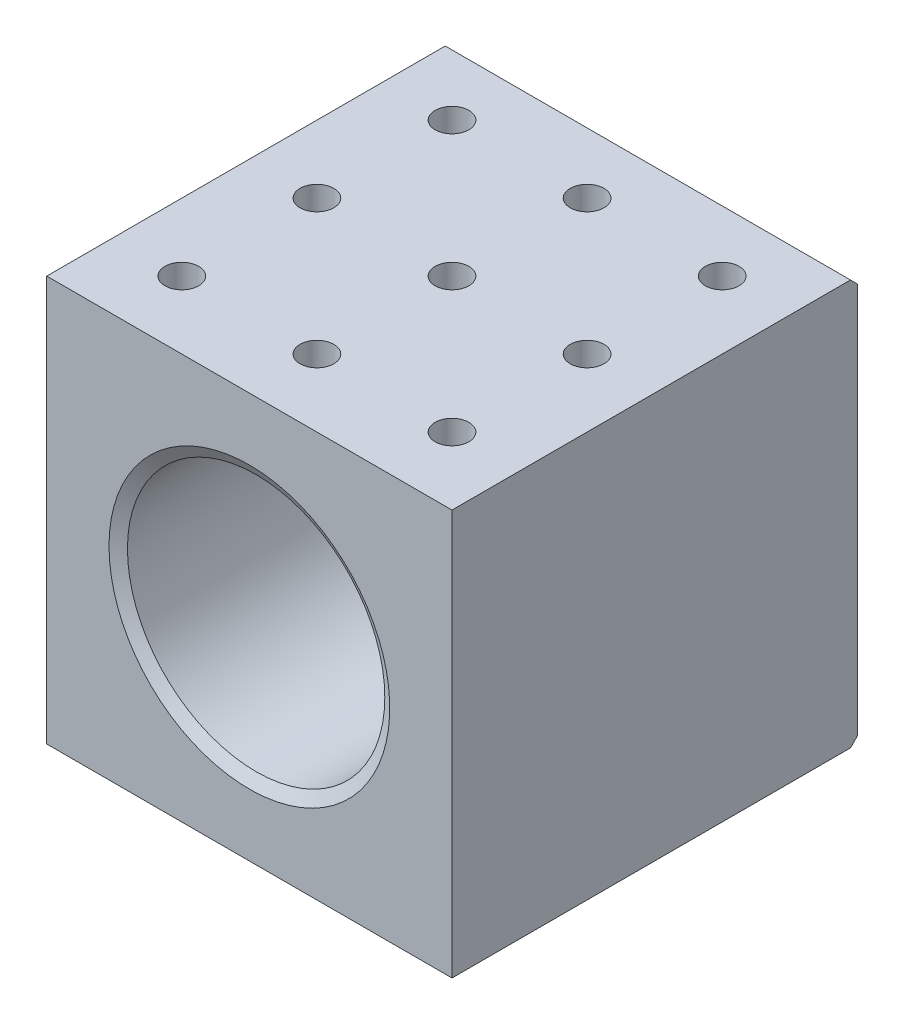
ISO-10303-21;
HEADER;
FILE_DESCRIPTION(('STEP AP214'),'2;1');
FILE_NAME('part.step','',(''),(''),'','','');
FILE_SCHEMA(('AUTOMOTIVE_DESIGN { 1 0 10303 214 1 1 1 1 }'));
ENDSEC;
DATA;
#1=APPLICATION_CONTEXT('core data for automotive mechanical design processes');
#2=APPLICATION_PROTOCOL_DEFINITION('international standard','automotive_design',2000,#1);
#3=PRODUCT_CONTEXT('',#1,'mechanical');
#4=PRODUCT('Part','Part','',(#3));
#5=PRODUCT_RELATED_PRODUCT_CATEGORY('part','',(#4));
#6=PRODUCT_DEFINITION_FORMATION('','',#4);
#7=PRODUCT_DEFINITION_CONTEXT('part definition',#1,'design');
#8=PRODUCT_DEFINITION('design','',#6,#7);
#9=PRODUCT_DEFINITION_SHAPE('','',#8);
#10=(LENGTH_UNIT() NAMED_UNIT(*) SI_UNIT(.MILLI.,.METRE.));
#11=(NAMED_UNIT(*) PLANE_ANGLE_UNIT() SI_UNIT($,.RADIAN.));
#12=(NAMED_UNIT(*) SI_UNIT($,.STERADIAN.) SOLID_ANGLE_UNIT());
#13=UNCERTAINTY_MEASURE_WITH_UNIT(LENGTH_MEASURE(1.E-05),#10,'distance_accuracy_value','');
#14=(GEOMETRIC_REPRESENTATION_CONTEXT(3) GLOBAL_UNCERTAINTY_ASSIGNED_CONTEXT((#13)) GLOBAL_UNIT_ASSIGNED_CONTEXT((#10,
#11,#12)) REPRESENTATION_CONTEXT('',''));
#15=CARTESIAN_POINT('',(0.,0.,0.));
#16=DIRECTION('',(0.,0.,1.));
#17=DIRECTION('',(1.,0.,0.));
#18=AXIS2_PLACEMENT_3D('',#15,#16,#17);
#19=CARTESIAN_POINT('',(0.,0.,15.));
#20=DIRECTION('',(0.,0.,-1.));
#21=DIRECTION('',(-1.,0.,0.));
#22=AXIS2_PLACEMENT_3D('',#19,#20,#21);
#23=PLANE('',#22);
#24=CARTESIAN_POINT('',(0.,0.,15.));
#25=DIRECTION('',(0.,0.,-1.));
#26=DIRECTION('',(-1.,0.,0.));
#27=AXIS2_PLACEMENT_3D('',#24,#25,#26);
#28=CIRCLE('',#27,10.3910254037845);
#29=CARTESIAN_POINT('',(-10.3910254037845,0.,15.));
#30=VERTEX_POINT('',#29);
#31=EDGE_CURVE('E254',#30,#30,#28,.T.);
#32=ORIENTED_EDGE('',*,*,#31,.T.);
#33=EDGE_LOOP('',(#32));
#34=FACE_BOUND('',#33,.T.);
#35=DIRECTION('',(0.,-1.,0.));
#36=VECTOR('',#35,1.);
#37=CARTESIAN_POINT('',(-15.,-15.,15.));
#38=LINE('',#37,#36);
#39=CARTESIAN_POINT('',(-15.,15.,15.));
#40=VERTEX_POINT('',#39);
#41=CARTESIAN_POINT('',(-15.,-15.,15.));
#42=VERTEX_POINT('',#41);
#43=EDGE_CURVE('E206',#40,#42,#38,.T.);
#44=ORIENTED_EDGE('',*,*,#43,.T.);
#45=DIRECTION('',(1.,0.,0.));
#46=VECTOR('',#45,1.);
#47=CARTESIAN_POINT('',(-15.,-15.,15.));
#48=LINE('',#47,#46);
#49=CARTESIAN_POINT('',(15.,-15.,15.));
#50=VERTEX_POINT('',#49);
#51=EDGE_CURVE('E210',#42,#50,#48,.T.);
#52=ORIENTED_EDGE('',*,*,#51,.T.);
#53=DIRECTION('',(0.,1.,0.));
#54=VECTOR('',#53,1.);
#55=CARTESIAN_POINT('',(15.,15.,15.));
#56=LINE('',#55,#54);
#57=CARTESIAN_POINT('',(15.,15.,15.));
#58=VERTEX_POINT('',#57);
#59=EDGE_CURVE('E214',#50,#58,#56,.T.);
#60=ORIENTED_EDGE('',*,*,#59,.T.);
#61=DIRECTION('',(-1.,0.,0.));
#62=VECTOR('',#61,1.);
#63=CARTESIAN_POINT('',(-15.,15.,15.));
#64=LINE('',#63,#62);
#65=EDGE_CURVE('E217',#58,#40,#64,.T.);
#66=ORIENTED_EDGE('',*,*,#65,.T.);
#67=EDGE_LOOP('',(#44,#52,#60,#66));
#68=FACE_BOUND('',#67,.T.);
#69=ADVANCED_FACE('F55',(#34,#68),#23,.F.);
#70=CARTESIAN_POINT('',(0.,0.,-15.));
#71=DIRECTION('',(0.,0.,-1.));
#72=DIRECTION('',(-1.,0.,0.));
#73=AXIS2_PLACEMENT_3D('',#70,#71,#72);
#74=PLANE('',#73);
#75=CARTESIAN_POINT('',(0.,0.,-15.));
#76=DIRECTION('',(0.,0.,-1.));
#77=DIRECTION('',(-1.,0.,0.));
#78=AXIS2_PLACEMENT_3D('',#75,#76,#77);
#79=CIRCLE('',#78,10.025);
#80=CARTESIAN_POINT('',(-10.025,0.,-15.));
#81=VERTEX_POINT('',#80);
#82=EDGE_CURVE('E242',#81,#81,#79,.F.);
#83=ORIENTED_EDGE('',*,*,#82,.T.);
#84=EDGE_LOOP('',(#83));
#85=FACE_BOUND('',#84,.T.);
#86=DIRECTION('',(0.,1.,0.));
#87=VECTOR('',#86,1.);
#88=CARTESIAN_POINT('',(15.,15.,-15.));
#89=LINE('',#88,#87);
#90=CARTESIAN_POINT('',(15.,-14.5,-15.));
#91=VERTEX_POINT('',#90);
#92=CARTESIAN_POINT('',(15.,14.5,-15.));
#93=VERTEX_POINT('',#92);
#94=EDGE_CURVE('E211',#91,#93,#89,.T.);
#95=ORIENTED_EDGE('',*,*,#94,.F.);
#96=DIRECTION('',(-1.,0.,0.));
#97=VECTOR('',#96,1.);
#98=CARTESIAN_POINT('',(-15.,-14.5,-15.));
#99=LINE('',#98,#97);
#100=CARTESIAN_POINT('',(-15.,-14.5,-15.));
#101=VERTEX_POINT('',#100);
#102=EDGE_CURVE('E86',#91,#101,#99,.T.);
#103=ORIENTED_EDGE('',*,*,#102,.T.);
#104=DIRECTION('',(0.,-1.,0.));
#105=VECTOR('',#104,1.);
#106=CARTESIAN_POINT('',(-15.,-15.,-15.));
#107=LINE('',#106,#105);
#108=CARTESIAN_POINT('',(-15.,14.5,-15.));
#109=VERTEX_POINT('',#108);
#110=EDGE_CURVE('E221',#109,#101,#107,.T.);
#111=ORIENTED_EDGE('',*,*,#110,.F.);
#112=DIRECTION('',(1.,0.,0.));
#113=VECTOR('',#112,1.);
#114=CARTESIAN_POINT('',(15.,14.5,-15.));
#115=LINE('',#114,#113);
#116=EDGE_CURVE('E268',#109,#93,#115,.T.);
#117=ORIENTED_EDGE('',*,*,#116,.T.);
#118=EDGE_LOOP('',(#95,#103,#111,#117));
#119=FACE_BOUND('',#118,.T.);
#120=ADVANCED_FACE('F347',(#85,#119),#74,.T.);
#121=CARTESIAN_POINT('',(-15.,-15.,15.));
#122=DIRECTION('',(1.,0.,0.));
#123=DIRECTION('',(0.,0.,-1.));
#124=AXIS2_PLACEMENT_3D('',#121,#122,#123);
#125=PLANE('',#124);
#126=ORIENTED_EDGE('',*,*,#110,.T.);
#127=DIRECTION('',(0.,-0.707106781186548,0.707106781186548));
#128=VECTOR('',#127,1.);
#129=CARTESIAN_POINT('',(-15.,-15.,-14.5));
#130=LINE('',#129,#128);
#131=CARTESIAN_POINT('',(-15.,-15.,-14.5));
#132=VERTEX_POINT('',#131);
#133=EDGE_CURVE('E71',#101,#132,#130,.T.);
#134=ORIENTED_EDGE('',*,*,#133,.T.);
#135=DIRECTION('',(0.,0.,-1.));
#136=VECTOR('',#135,1.);
#137=CARTESIAN_POINT('',(-15.,-15.,15.));
#138=LINE('',#137,#136);
#139=EDGE_CURVE('E238',#42,#132,#138,.T.);
#140=ORIENTED_EDGE('',*,*,#139,.F.);
#141=ORIENTED_EDGE('',*,*,#43,.F.);
#142=DIRECTION('',(0.,0.,-1.));
#143=VECTOR('',#142,1.);
#144=CARTESIAN_POINT('',(-15.,15.,15.));
#145=LINE('',#144,#143);
#146=CARTESIAN_POINT('',(-15.,15.,-14.5));
#147=VERTEX_POINT('',#146);
#148=EDGE_CURVE('E220',#40,#147,#145,.T.);
#149=ORIENTED_EDGE('',*,*,#148,.T.);
#150=DIRECTION('',(0.,-0.707106781186548,-0.707106781186548));
#151=VECTOR('',#150,1.);
#152=CARTESIAN_POINT('',(-15.,15.,-14.5));
#153=LINE('',#152,#151);
#154=EDGE_CURVE('E79',#147,#109,#153,.T.);
#155=ORIENTED_EDGE('',*,*,#154,.T.);
#156=EDGE_LOOP('',(#126,#134,#140,#141,#149,#155));
#157=FACE_BOUND('',#156,.T.);
#158=ADVANCED_FACE('F353',(#157),#125,.F.);
#159=CARTESIAN_POINT('',(-15.,-15.,15.));
#160=DIRECTION('',(0.,1.,0.));
#161=DIRECTION('',(-1.,0.,0.));
#162=AXIS2_PLACEMENT_3D('',#159,#160,#161);
#163=PLANE('',#162);
#164=ORIENTED_EDGE('',*,*,#139,.T.);
#165=DIRECTION('',(1.,0.,0.));
#166=VECTOR('',#165,1.);
#167=CARTESIAN_POINT('',(15.,-15.,-14.5));
#168=LINE('',#167,#166);
#169=CARTESIAN_POINT('',(15.,-15.,-14.5));
#170=VERTEX_POINT('',#169);
#171=EDGE_CURVE('E258',#132,#170,#168,.T.);
#172=ORIENTED_EDGE('',*,*,#171,.T.);
#173=DIRECTION('',(0.,0.,-1.));
#174=VECTOR('',#173,1.);
#175=CARTESIAN_POINT('',(15.,-15.,15.));
#176=LINE('',#175,#174);
#177=EDGE_CURVE('E234',#50,#170,#176,.T.);
#178=ORIENTED_EDGE('',*,*,#177,.F.);
#179=ORIENTED_EDGE('',*,*,#51,.F.);
#180=EDGE_LOOP('',(#164,#172,#178,#179));
#181=FACE_BOUND('',#180,.T.);
#182=ADVANCED_FACE('F365',(#181),#163,.F.);
#183=CARTESIAN_POINT('',(15.,15.,15.));
#184=DIRECTION('',(-1.,0.,0.));
#185=DIRECTION('',(0.,-1.,0.));
#186=AXIS2_PLACEMENT_3D('',#183,#184,#185);
#187=PLANE('',#186);
#188=ORIENTED_EDGE('',*,*,#177,.T.);
#189=DIRECTION('',(0.,0.707106781186548,-0.707106781186548));
#190=VECTOR('',#189,1.);
#191=CARTESIAN_POINT('',(15.,-15.,-14.5));
#192=LINE('',#191,#190);
#193=EDGE_CURVE('E265',#170,#91,#192,.T.);
#194=ORIENTED_EDGE('',*,*,#193,.T.);
#195=ORIENTED_EDGE('',*,*,#94,.T.);
#196=DIRECTION('',(0.,0.707106781186548,0.707106781186548));
#197=VECTOR('',#196,1.);
#198=CARTESIAN_POINT('',(15.,15.,-14.5));
#199=LINE('',#198,#197);
#200=CARTESIAN_POINT('',(15.,15.,-14.5));
#201=VERTEX_POINT('',#200);
#202=EDGE_CURVE('E262',#93,#201,#199,.T.);
#203=ORIENTED_EDGE('',*,*,#202,.T.);
#204=DIRECTION('',(0.,0.,-1.));
#205=VECTOR('',#204,1.);
#206=CARTESIAN_POINT('',(15.,15.,15.));
#207=LINE('',#206,#205);
#208=EDGE_CURVE('E230',#58,#201,#207,.T.);
#209=ORIENTED_EDGE('',*,*,#208,.F.);
#210=ORIENTED_EDGE('',*,*,#59,.F.);
#211=EDGE_LOOP('',(#188,#194,#195,#203,#209,#210));
#212=FACE_BOUND('',#211,.T.);
#213=ADVANCED_FACE('F361',(#212),#187,.F.);
#214=CARTESIAN_POINT('',(-15.,15.,15.));
#215=DIRECTION('',(0.,-1.,0.));
#216=DIRECTION('',(1.,0.,0.));
#217=AXIS2_PLACEMENT_3D('',#214,#215,#216);
#218=PLANE('',#217);
#219=CARTESIAN_POINT('',(-10.,15.,0.));
#220=DIRECTION('',(0.,1.,0.));
#221=DIRECTION('',(0.,0.,1.));
#222=AXIS2_PLACEMENT_3D('',#219,#220,#221);
#223=CIRCLE('',#222,1.25);
#224=CARTESIAN_POINT('',(-10.,15.,1.25));
#225=VERTEX_POINT('',#224);
#226=EDGE_CURVE('E147',#225,#225,#223,.T.);
#227=ORIENTED_EDGE('',*,*,#226,.F.);
#228=EDGE_LOOP('',(#227));
#229=FACE_BOUND('',#228,.T.);
#230=CARTESIAN_POINT('',(10.,15.,0.));
#231=DIRECTION('',(0.,1.,0.));
#232=DIRECTION('',(0.,0.,1.));
#233=AXIS2_PLACEMENT_3D('',#230,#231,#232);
#234=CIRCLE('',#233,1.25);
#235=CARTESIAN_POINT('',(10.,15.,1.25));
#236=VERTEX_POINT('',#235);
#237=EDGE_CURVE('E146',#236,#236,#234,.T.);
#238=ORIENTED_EDGE('',*,*,#237,.F.);
#239=EDGE_LOOP('',(#238));
#240=FACE_BOUND('',#239,.T.);
#241=CARTESIAN_POINT('',(0.,15.,0.));
#242=DIRECTION('',(0.,1.,0.));
#243=DIRECTION('',(0.,0.,1.));
#244=AXIS2_PLACEMENT_3D('',#241,#242,#243);
#245=CIRCLE('',#244,1.25);
#246=CARTESIAN_POINT('',(0.,15.,1.25));
#247=VERTEX_POINT('',#246);
#248=EDGE_CURVE('E160',#247,#247,#245,.T.);
#249=ORIENTED_EDGE('',*,*,#248,.F.);
#250=EDGE_LOOP('',(#249));
#251=FACE_BOUND('',#250,.T.);
#252=CARTESIAN_POINT('',(-10.,15.,-10.));
#253=DIRECTION('',(0.,1.,0.));
#254=DIRECTION('',(0.,0.,1.));
#255=AXIS2_PLACEMENT_3D('',#252,#253,#254);
#256=CIRCLE('',#255,1.25);
#257=CARTESIAN_POINT('',(-10.,15.,-8.75));
#258=VERTEX_POINT('',#257);
#259=EDGE_CURVE('E164',#258,#258,#256,.T.);
#260=ORIENTED_EDGE('',*,*,#259,.F.);
#261=EDGE_LOOP('',(#260));
#262=FACE_BOUND('',#261,.T.);
#263=CARTESIAN_POINT('',(-10.,15.,10.));
#264=DIRECTION('',(0.,1.,0.));
#265=DIRECTION('',(0.,0.,1.));
#266=AXIS2_PLACEMENT_3D('',#263,#264,#265);
#267=CIRCLE('',#266,1.25);
#268=CARTESIAN_POINT('',(-10.,15.,11.25));
#269=VERTEX_POINT('',#268);
#270=EDGE_CURVE('E172',#269,#269,#267,.T.);
#271=ORIENTED_EDGE('',*,*,#270,.F.);
#272=EDGE_LOOP('',(#271));
#273=FACE_BOUND('',#272,.T.);
#274=CARTESIAN_POINT('',(10.,15.,-10.));
#275=DIRECTION('',(0.,1.,0.));
#276=DIRECTION('',(0.,0.,1.));
#277=AXIS2_PLACEMENT_3D('',#274,#275,#276);
#278=CIRCLE('',#277,1.25);
#279=CARTESIAN_POINT('',(10.,15.,-8.75));
#280=VERTEX_POINT('',#279);
#281=EDGE_CURVE('E180',#280,#280,#278,.T.);
#282=ORIENTED_EDGE('',*,*,#281,.F.);
#283=EDGE_LOOP('',(#282));
#284=FACE_BOUND('',#283,.T.);
#285=CARTESIAN_POINT('',(10.,15.,10.));
#286=DIRECTION('',(0.,1.,0.));
#287=DIRECTION('',(0.,0.,1.));
#288=AXIS2_PLACEMENT_3D('',#285,#286,#287);
#289=CIRCLE('',#288,1.25);
#290=CARTESIAN_POINT('',(10.,15.,11.25));
#291=VERTEX_POINT('',#290);
#292=EDGE_CURVE('E188',#291,#291,#289,.T.);
#293=ORIENTED_EDGE('',*,*,#292,.F.);
#294=EDGE_LOOP('',(#293));
#295=FACE_BOUND('',#294,.T.);
#296=CARTESIAN_POINT('',(0.,15.,-10.));
#297=DIRECTION('',(0.,1.,0.));
#298=DIRECTION('',(0.,0.,1.));
#299=AXIS2_PLACEMENT_3D('',#296,#297,#298);
#300=CIRCLE('',#299,1.25);
#301=CARTESIAN_POINT('',(0.,15.,-8.75));
#302=VERTEX_POINT('',#301);
#303=EDGE_CURVE('E196',#302,#302,#300,.T.);
#304=ORIENTED_EDGE('',*,*,#303,.F.);
#305=EDGE_LOOP('',(#304));
#306=FACE_BOUND('',#305,.T.);
#307=CARTESIAN_POINT('',(0.,15.,10.));
#308=DIRECTION('',(0.,1.,0.));
#309=DIRECTION('',(0.,0.,1.));
#310=AXIS2_PLACEMENT_3D('',#307,#308,#309);
#311=CIRCLE('',#310,1.25);
#312=CARTESIAN_POINT('',(0.,15.,11.25));
#313=VERTEX_POINT('',#312);
#314=EDGE_CURVE('E201',#313,#313,#311,.T.);
#315=ORIENTED_EDGE('',*,*,#314,.F.);
#316=EDGE_LOOP('',(#315));
#317=FACE_BOUND('',#316,.T.);
#318=ORIENTED_EDGE('',*,*,#208,.T.);
#319=DIRECTION('',(-1.,0.,0.));
#320=VECTOR('',#319,1.);
#321=CARTESIAN_POINT('',(-15.,15.,-14.5));
#322=LINE('',#321,#320);
#323=EDGE_CURVE('E11',#201,#147,#322,.T.);
#324=ORIENTED_EDGE('',*,*,#323,.T.);
#325=ORIENTED_EDGE('',*,*,#148,.F.);
#326=ORIENTED_EDGE('',*,*,#65,.F.);
#327=EDGE_LOOP('',(#318,#324,#325,#326));
#328=FACE_BOUND('',#327,.T.);
#329=ADVANCED_FACE('F358',(#229,#240,#251,#262,#273,#284,#295,#306,#317,#328),#218,.F.);
#330=CARTESIAN_POINT('',(0.,0.,15.));
#331=DIRECTION('',(0.,0.,-1.));
#332=DIRECTION('',(-1.,0.,0.));
#333=AXIS2_PLACEMENT_3D('',#330,#331,#332);
#334=CYLINDRICAL_SURFACE('',#333,9.525);
#335=CARTESIAN_POINT('',(0.,9.525,1.25));
#336=CARTESIAN_POINT('',(-0.0698908445200793,9.52499898596995,1.24999704931891));
#337=CARTESIAN_POINT('',(-0.139824639435347,9.52422264141759,1.24411855386082));
#338=CARTESIAN_POINT('',(-0.27774417784955,9.52120033392475,1.22076203109199));
#339=CARTESIAN_POINT('',(-0.345727844176988,9.518952860567,1.20327208196499));
#340=CARTESIAN_POINT('',(-0.477730651991829,9.51324134046286,1.15721856824004));
#341=CARTESIAN_POINT('',(-0.541752503331227,9.50977813633241,1.12866267196508));
#342=CARTESIAN_POINT('',(-0.664083764775871,9.50201975058155,1.0613051118828));
#343=CARTESIAN_POINT('',(-0.722394108915497,9.49772470533989,1.02250512719611));
#344=CARTESIAN_POINT('',(-0.832011154094293,9.48875270412421,0.935510300963678));
#345=CARTESIAN_POINT('',(-0.88327835170039,9.48407381180408,0.887265878082161));
#346=CARTESIAN_POINT('',(-0.977013449949314,9.47487696132217,0.782858192981347));
#347=CARTESIAN_POINT('',(-1.01948088935163,9.47035901160649,0.726694515932433));
#348=CARTESIAN_POINT('',(-1.09455975785718,9.46197661297454,0.607783736867021));
#349=CARTESIAN_POINT('',(-1.1271338797346,9.45811466133028,0.545012888277368));
#350=CARTESIAN_POINT('',(-1.18126316646653,9.4515073095938,0.414832451938452));
#351=CARTESIAN_POINT('',(-1.20281879115845,9.44876186290721,0.347423057903886));
#352=CARTESIAN_POINT('',(-1.23417850198932,9.44471701662963,0.210290451341234));
#353=CARTESIAN_POINT('',(-1.24404953022223,9.44340938278071,0.140582794399568));
#354=CARTESIAN_POINT('',(-1.25196704389927,9.44236307356307,0.00048903747048921));
#355=CARTESIAN_POINT('',(-1.25001405189975,9.44262432885811,-0.069897032397562));
#356=CARTESIAN_POINT('',(-1.23439385672255,9.44467874410638,-0.208881614173356));
#357=CARTESIAN_POINT('',(-1.22080058152931,9.44646223602916,-0.277488597980302));
#358=CARTESIAN_POINT('',(-1.18240111749693,9.45134508655108,-0.411439260225632));
#359=CARTESIAN_POINT('',(-1.15759468032022,9.45444447429322,-0.476782866354489));
#360=CARTESIAN_POINT('',(-1.09739419640763,9.46162079166662,-0.602580469964923));
#361=CARTESIAN_POINT('',(-1.06196821343834,9.46570066246681,-0.663019009717517));
#362=CARTESIAN_POINT('',(-0.981557073163777,9.47437601124965,-0.777121401169548));
#363=CARTESIAN_POINT('',(-0.936571434214305,9.47897151520593,-0.830784911305392));
#364=CARTESIAN_POINT('',(-0.837909156230847,9.48820325299715,-0.930242888836987));
#365=CARTESIAN_POINT('',(-0.784168831856059,9.49283953009469,-0.975974200067348));
#366=CARTESIAN_POINT('',(-0.669741430350354,9.50159768061089,-1.05777724724657));
#367=CARTESIAN_POINT('',(-0.609054334284059,9.50571955262732,-1.09384895686457));
#368=CARTESIAN_POINT('',(-0.482405964475214,9.51298740691907,-1.15530964508296));
#369=CARTESIAN_POINT('',(-0.416442644916573,9.51613300832311,-1.18069445578975));
#370=CARTESIAN_POINT('',(-0.281139182959165,9.52109051808703,-1.22000952293789));
#371=CARTESIAN_POINT('',(-0.211799215115208,9.52290249531034,-1.23394037082397));
#372=CARTESIAN_POINT('',(-0.0722566079430353,9.52497960652179,-1.24986971757699));
#373=CARTESIAN_POINT('',(-0.00206405669281693,9.52525601315131,-1.25195517612765));
#374=CARTESIAN_POINT('',(0.137669580937589,9.52426133353775,-1.24436434304517));
#375=CARTESIAN_POINT('',(0.207210682605878,9.52299028370223,-1.2346883281285));
#376=CARTESIAN_POINT('',(0.343409227684851,9.51905051431592,-1.20392147587359));
#377=CARTESIAN_POINT('',(0.410076245382912,9.51638689862853,-1.18287231264927));
#378=CARTESIAN_POINT('',(0.538934293027684,9.50996007075211,-1.13000014341496));
#379=CARTESIAN_POINT('',(0.601125156889448,9.5061968177879,-1.09817673788296));
#380=CARTESIAN_POINT('',(0.719652508112473,9.49796184622471,-1.02445052920448));
#381=CARTESIAN_POINT('',(0.775953888679997,9.49348624043087,-0.982491727714507));
#382=CARTESIAN_POINT('',(0.880746395544479,9.4843388238667,-0.889764709925934));
#383=CARTESIAN_POINT('',(0.929237178632502,9.47966700448582,-0.838996106715436));
#384=CARTESIAN_POINT('',(1.01734239363289,9.47061869563237,-0.72970659232319));
#385=CARTESIAN_POINT('',(1.05689902678323,9.46624425041374,-0.67113889173217));
#386=CARTESIAN_POINT('',(1.1256132088323,9.45832021872484,-0.548139723434801));
#387=CARTESIAN_POINT('',(1.1547709839075,9.45477061431477,-0.483708383301613));
#388=CARTESIAN_POINT('',(1.20176711520171,9.44891231175766,-0.350994096146556));
#389=CARTESIAN_POINT('',(1.21963755146962,9.44660009967147,-0.282722670936582));
#390=CARTESIAN_POINT('',(1.24365477933522,9.44346847890593,-0.144115580695131));
#391=CARTESIAN_POINT('',(1.24980217684765,9.4426489930739,-0.0737800225408424));
#392=CARTESIAN_POINT('',(1.25018693846831,9.44259801167003,0.0663835217608374));
#393=CARTESIAN_POINT('',(1.24451511937354,9.44335440729078,0.136211271501082));
#394=CARTESIAN_POINT('',(1.22161530004844,9.44634386353605,0.273911581315713));
#395=CARTESIAN_POINT('',(1.20438730265681,9.44857692379783,0.341784141870376));
#396=CARTESIAN_POINT('',(1.15889345110378,9.45426424049389,0.473632364901488));
#397=CARTESIAN_POINT('',(1.13063243724488,9.45771796134846,0.537609722037205));
#398=CARTESIAN_POINT('',(1.06388370356963,9.465458276128,0.659928965320984));
#399=CARTESIAN_POINT('',(1.02539580408997,9.46974488468458,0.718270752440247));
#400=CARTESIAN_POINT('',(0.938950428583845,9.47870739781261,0.828126396433741));
#401=CARTESIAN_POINT('',(0.890925343968055,9.48338593530287,0.879586841652105));
#402=CARTESIAN_POINT('',(0.78691064363724,9.49258219272797,0.973752414580849));
#403=CARTESIAN_POINT('',(0.730919159830635,9.49709987463121,1.01645548296788));
#404=CARTESIAN_POINT('',(0.612290215843527,9.50548649173664,1.09204841139897));
#405=CARTESIAN_POINT('',(0.549625921092735,9.5093526326094,1.12489645228047));
#406=CARTESIAN_POINT('',(0.419653348440683,9.51597253507549,1.17955526443433));
#407=CARTESIAN_POINT('',(0.352350150978138,9.51872749164518,1.20137789893218));
#408=CARTESIAN_POINT('',(0.237257518542989,9.52215863687289,1.22820574416349));
#409=CARTESIAN_POINT('',(0.190190562607772,9.52321889240151,1.23636667394512));
#410=CARTESIAN_POINT('',(0.0954224088599646,9.52463991720257,1.24726478634247));
#411=CARTESIAN_POINT('',(0.0477212164014278,9.52500069237606,1.25000201471439));
#412=CARTESIAN_POINT('',(0.,9.525,1.25));
#413=B_SPLINE_CURVE_WITH_KNOTS('',3,(#335,#336,#337,#338,#339,#340,#341,#342,#343,#344,#345,
#346,#347,#348,#349,#350,#351,#352,#353,#354,#355,#356,#357,#358,#359,#360,#361,#362,#363,#364,
#365,#366,#367,#368,#369,#370,#371,#372,#373,#374,#375,#376,#377,#378,#379,#380,#381,#382,#383,
#384,#385,#386,#387,#388,#389,#390,#391,#392,#393,#394,#395,#396,#397,#398,#399,#400,#401,#402,
#403,#404,#405,#406,#407,#408,#409,#410,#411,#412),.UNSPECIFIED.,.T.,.F.,(4,2,2,2,2,2,2,2,2,2,2,
2,2,2,2,2,2,2,2,2,2,2,2,2,2,2,2,2,2,2,2,2,2,2,2,2,2,2,4),(0.,0.209498207675428,
0.419211846581093,0.628780420230178,0.838314664549649,1.04897993895877,1.25965625262502,
1.47111742513662,1.68256977197093,1.89280473423349,2.10303040534015,2.31193074246016,
2.52083570631669,2.73037532395759,2.9399255013381,3.15107433542933,3.36222374507978,
3.57345542694482,3.78467620081991,3.99434433094807,4.20400752823324,4.41290762528587,
4.6218154694571,4.83190505355924,5.04200386678423,5.25342526501399,5.46484206452131,
5.67565525439724,5.88645754792762,6.0956460478033,6.30483449629311,6.51393127451434,
6.72303172633691,6.93367109595178,7.1443599413903,7.35593058126479,7.56727308584749,
7.71031891275546,7.85336353287475),.UNSPECIFIED.);
#414=CARTESIAN_POINT('',(0.,9.525,1.25));
#415=VERTEX_POINT('',#414);
#416=EDGE_CURVE('E60',#415,#415,#413,.T.);
#417=ORIENTED_EDGE('',*,*,#416,.F.);
#418=EDGE_LOOP('',(#417));
#419=FACE_BOUND('',#418,.T.);
#420=CARTESIAN_POINT('',(0.,9.525,-8.75));
#421=CARTESIAN_POINT('',(-0.0698908445200794,9.52499898596995,-8.75000295068109));
#422=CARTESIAN_POINT('',(-0.139824639435347,9.52422264141759,-8.75588144613918));
#423=CARTESIAN_POINT('',(-0.277744177849551,9.52120033392475,-8.779237968908));
#424=CARTESIAN_POINT('',(-0.345727844176988,9.518952860567,-8.79672791803501));
#425=CARTESIAN_POINT('',(-0.477730651991829,9.51324134046286,-8.84278143175996));
#426=CARTESIAN_POINT('',(-0.541752503331227,9.50977813633241,-8.87133732803492));
#427=CARTESIAN_POINT('',(-0.664083764775871,9.50201975058155,-8.9386948881172));
#428=CARTESIAN_POINT('',(-0.722394108915497,9.49772470533989,-8.97749487280388));
#429=CARTESIAN_POINT('',(-0.832011154094292,9.48875270412421,-9.06448969903632));
#430=CARTESIAN_POINT('',(-0.88327835170039,9.48407381180408,-9.11273412191784));
#431=CARTESIAN_POINT('',(-0.977013449949313,9.47487696132217,-9.21714180701865));
#432=CARTESIAN_POINT('',(-1.01948088935163,9.47035901160649,-9.27330548406757));
#433=CARTESIAN_POINT('',(-1.09455975785718,9.46197661297454,-9.39221626313298));
#434=CARTESIAN_POINT('',(-1.1271338797346,9.45811466133028,-9.45498711172263));
#435=CARTESIAN_POINT('',(-1.18126316646653,9.45150730959381,-9.58516754806154));
#436=CARTESIAN_POINT('',(-1.20281879115845,9.44876186290721,-9.65257694209611));
#437=CARTESIAN_POINT('',(-1.23417850198932,9.44471701662963,-9.78970954865876));
#438=CARTESIAN_POINT('',(-1.24404953022223,9.44340938278071,-9.85941720560043));
#439=CARTESIAN_POINT('',(-1.25196704389927,9.44236307356307,-9.99951096252951));
#440=CARTESIAN_POINT('',(-1.25001405189975,9.44262432885811,-10.0698970323976));
#441=CARTESIAN_POINT('',(-1.23439385672255,9.44467874410638,-10.2088816141734));
#442=CARTESIAN_POINT('',(-1.22080058152931,9.44646223602916,-10.2774885979803));
#443=CARTESIAN_POINT('',(-1.18240111749693,9.45134508655108,-10.4114392602256));
#444=CARTESIAN_POINT('',(-1.15759468032022,9.45444447429322,-10.4767828663545));
#445=CARTESIAN_POINT('',(-1.09739419640763,9.46162079166662,-10.6025804699649));
#446=CARTESIAN_POINT('',(-1.06196821343834,9.46570066246681,-10.6630190097175));
#447=CARTESIAN_POINT('',(-0.981557073163777,9.47437601124965,-10.7771214011695));
#448=CARTESIAN_POINT('',(-0.936571434214305,9.47897151520593,-10.8307849113054));
#449=CARTESIAN_POINT('',(-0.837909156230847,9.48820325299715,-10.930242888837));
#450=CARTESIAN_POINT('',(-0.784168831856057,9.49283953009469,-10.9759742000673));
#451=CARTESIAN_POINT('',(-0.669741430350353,9.50159768061089,-11.0577772472466));
#452=CARTESIAN_POINT('',(-0.609054334284059,9.50571955262732,-11.0938489568646));
#453=CARTESIAN_POINT('',(-0.482405964475215,9.51298740691907,-11.155309645083));
#454=CARTESIAN_POINT('',(-0.416442644916573,9.51613300832311,-11.1806944557897));
#455=CARTESIAN_POINT('',(-0.281139182959165,9.52109051808703,-11.2200095229379));
#456=CARTESIAN_POINT('',(-0.211799215115207,9.52290249531034,-11.233940370824));
#457=CARTESIAN_POINT('',(-0.0722566079430346,9.52497960652179,-11.249869717577));
#458=CARTESIAN_POINT('',(-0.00206405669281604,9.52525601315131,-11.2519551761277));
#459=CARTESIAN_POINT('',(0.13766958093759,9.52426133353775,-11.2443643430452));
#460=CARTESIAN_POINT('',(0.207210682605879,9.52299028370223,-11.2346883281285));
#461=CARTESIAN_POINT('',(0.343409227684851,9.51905051431592,-11.2039214758736));
#462=CARTESIAN_POINT('',(0.410076245382912,9.51638689862853,-11.1828723126493));
#463=CARTESIAN_POINT('',(0.538934293027685,9.50996007075211,-11.130000143415));
#464=CARTESIAN_POINT('',(0.601125156889449,9.5061968177879,-11.098176737883));
#465=CARTESIAN_POINT('',(0.719652508112474,9.49796184622471,-11.0244505292045));
#466=CARTESIAN_POINT('',(0.775953888679998,9.49348624043087,-10.9824917277145));
#467=CARTESIAN_POINT('',(0.88074639554448,9.4843388238667,-10.8897647099259));
#468=CARTESIAN_POINT('',(0.929237178632503,9.47966700448582,-10.8389961067154));
#469=CARTESIAN_POINT('',(1.01734239363289,9.47061869563237,-10.7297065923232));
#470=CARTESIAN_POINT('',(1.05689902678323,9.46624425041374,-10.6711388917322));
#471=CARTESIAN_POINT('',(1.1256132088323,9.45832021872484,-10.5481397234348));
#472=CARTESIAN_POINT('',(1.1547709839075,9.45477061431477,-10.4837083833016));
#473=CARTESIAN_POINT('',(1.20176711520171,9.44891231175766,-10.3509940961466));
#474=CARTESIAN_POINT('',(1.21963755146962,9.44660009967147,-10.2827226709366));
#475=CARTESIAN_POINT('',(1.24365477933522,9.44346847890593,-10.1441155806951));
#476=CARTESIAN_POINT('',(1.24980217684765,9.4426489930739,-10.0737800225408));
#477=CARTESIAN_POINT('',(1.25018693846831,9.44259801167003,-9.93361647823916));
#478=CARTESIAN_POINT('',(1.24451511937354,9.44335440729078,-9.86378872849892));
#479=CARTESIAN_POINT('',(1.22161530004844,9.44634386353605,-9.72608841868428));
#480=CARTESIAN_POINT('',(1.20438730265681,9.44857692379783,-9.65821585812962));
#481=CARTESIAN_POINT('',(1.15889345110378,9.45426424049389,-9.52636763509851));
#482=CARTESIAN_POINT('',(1.13063243724488,9.45771796134846,-9.46239027796279));
#483=CARTESIAN_POINT('',(1.06388370356962,9.465458276128,-9.34007103467901));
#484=CARTESIAN_POINT('',(1.02539580408997,9.46974488468458,-9.28172924755975));
#485=CARTESIAN_POINT('',(0.938950428583844,9.47870739781261,-9.17187360356626));
#486=CARTESIAN_POINT('',(0.890925343968054,9.48338593530287,-9.12041315834789));
#487=CARTESIAN_POINT('',(0.786910643637239,9.49258219272797,-9.02624758541915));
#488=CARTESIAN_POINT('',(0.730919159830634,9.49709987463121,-8.98354451703211));
#489=CARTESIAN_POINT('',(0.612290215843526,9.50548649173664,-8.90795158860102));
#490=CARTESIAN_POINT('',(0.549625921092735,9.5093526326094,-8.87510354771953));
#491=CARTESIAN_POINT('',(0.419653348440683,9.51597253507549,-8.82044473556567));
#492=CARTESIAN_POINT('',(0.352350150978138,9.51872749164518,-8.79862210106782));
#493=CARTESIAN_POINT('',(0.237257518542989,9.52215863687289,-8.77179425583651));
#494=CARTESIAN_POINT('',(0.190190562607772,9.52321889240151,-8.76363332605488));
#495=CARTESIAN_POINT('',(0.0954224088599644,9.52463991720257,-8.75273521365753));
#496=CARTESIAN_POINT('',(0.0477212164014277,9.52500069237606,-8.7499979852856));
#497=CARTESIAN_POINT('',(0.,9.525,-8.75));
#498=B_SPLINE_CURVE_WITH_KNOTS('',3,(#420,#421,#422,#423,#424,#425,#426,#427,#428,#429,#430,
#431,#432,#433,#434,#435,#436,#437,#438,#439,#440,#441,#442,#443,#444,#445,#446,#447,#448,#449,
#450,#451,#452,#453,#454,#455,#456,#457,#458,#459,#460,#461,#462,#463,#464,#465,#466,#467,#468,
#469,#470,#471,#472,#473,#474,#475,#476,#477,#478,#479,#480,#481,#482,#483,#484,#485,#486,#487,
#488,#489,#490,#491,#492,#493,#494,#495,#496,#497),.UNSPECIFIED.,.T.,.F.,(4,2,2,2,2,2,2,2,2,2,2,
2,2,2,2,2,2,2,2,2,2,2,2,2,2,2,2,2,2,2,2,2,2,2,2,2,2,2,4),(0.,0.209498207675428,
0.419211846581093,0.628780420230178,0.838314664549649,1.04897993895877,1.25965625262502,
1.47111742513662,1.68256977197093,1.89280473423349,2.10303040534015,2.31193074246016,
2.52083570631669,2.73037532395759,2.93992550133811,3.15107433542933,3.36222374507978,
3.57345542694482,3.78467620081991,3.99434433094807,4.20400752823324,4.41290762528587,
4.6218154694571,4.83190505355925,5.04200386678424,5.25342526501399,5.46484206452132,
5.67565525439725,5.88645754792762,6.0956460478033,6.30483449629311,6.51393127451434,
6.72303172633691,6.93367109595178,7.14435994139031,7.35593058126479,7.5672730858475,
7.71031891275547,7.85336353287476),.UNSPECIFIED.);
#499=CARTESIAN_POINT('',(0.,9.525,-8.75));
#500=VERTEX_POINT('',#499);
#501=EDGE_CURVE('E200',#500,#500,#498,.T.);
#502=ORIENTED_EDGE('',*,*,#501,.F.);
#503=EDGE_LOOP('',(#502));
#504=FACE_BOUND('',#503,.T.);
#505=CARTESIAN_POINT('',(0.,9.525,11.25));
#506=CARTESIAN_POINT('',(-0.0698908445200793,9.52499898596995,11.2499970493189));
#507=CARTESIAN_POINT('',(-0.139824639435347,9.52422264141759,11.2441185538608));
#508=CARTESIAN_POINT('',(-0.27774417784955,9.52120033392475,11.220762031092));
#509=CARTESIAN_POINT('',(-0.345727844176988,9.518952860567,11.203272081965));
#510=CARTESIAN_POINT('',(-0.477730651991829,9.51324134046286,11.15721856824));
#511=CARTESIAN_POINT('',(-0.541752503331227,9.50977813633241,11.1286626719651));
#512=CARTESIAN_POINT('',(-0.664083764775871,9.50201975058155,11.0613051118828));
#513=CARTESIAN_POINT('',(-0.722394108915497,9.49772470533989,11.0225051271961));
#514=CARTESIAN_POINT('',(-0.832011154094292,9.48875270412421,10.9355103009637));
#515=CARTESIAN_POINT('',(-0.88327835170039,9.48407381180408,10.8872658780822));
#516=CARTESIAN_POINT('',(-0.977013449949314,9.47487696132217,10.7828581929814));
#517=CARTESIAN_POINT('',(-1.01948088935163,9.47035901160649,10.7266945159324));
#518=CARTESIAN_POINT('',(-1.09455975785718,9.46197661297454,10.607783736867));
#519=CARTESIAN_POINT('',(-1.1271338797346,9.45811466133028,10.5450128882774));
#520=CARTESIAN_POINT('',(-1.18126316646653,9.45150730959381,10.4148324519385));
#521=CARTESIAN_POINT('',(-1.20281879115845,9.44876186290721,10.3474230579039));
#522=CARTESIAN_POINT('',(-1.23417850198932,9.44471701662963,10.2102904513412));
#523=CARTESIAN_POINT('',(-1.24404953022223,9.44340938278071,10.1405827943996));
#524=CARTESIAN_POINT('',(-1.25196704389927,9.44236307356307,10.0004890374705));
#525=CARTESIAN_POINT('',(-1.25001405189975,9.44262432885811,9.93010296760244));
#526=CARTESIAN_POINT('',(-1.23439385672255,9.44467874410638,9.79111838582665));
#527=CARTESIAN_POINT('',(-1.22080058152931,9.44646223602916,9.7225114020197));
#528=CARTESIAN_POINT('',(-1.18240111749693,9.45134508655108,9.58856073977437));
#529=CARTESIAN_POINT('',(-1.15759468032022,9.45444447429322,9.52321713364551));
#530=CARTESIAN_POINT('',(-1.09739419640763,9.46162079166662,9.39741953003508));
#531=CARTESIAN_POINT('',(-1.06196821343834,9.46570066246681,9.33698099028248));
#532=CARTESIAN_POINT('',(-0.981557073163777,9.47437601124965,9.22287859883045));
#533=CARTESIAN_POINT('',(-0.936571434214305,9.47897151520593,9.16921508869461));
#534=CARTESIAN_POINT('',(-0.837909156230847,9.48820325299715,9.06975711116301));
#535=CARTESIAN_POINT('',(-0.784168831856058,9.49283953009469,9.02402579993265));
#536=CARTESIAN_POINT('',(-0.669741430350354,9.50159768061089,8.94222275275343));
#537=CARTESIAN_POINT('',(-0.609054334284059,9.50571955262732,8.90615104313543));
#538=CARTESIAN_POINT('',(-0.482405964475214,9.51298740691907,8.84469035491704));
#539=CARTESIAN_POINT('',(-0.416442644916573,9.51613300832311,8.81930554421025));
#540=CARTESIAN_POINT('',(-0.281139182959165,9.52109051808703,8.77999047706211));
#541=CARTESIAN_POINT('',(-0.211799215115207,9.52290249531034,8.76605962917603));
#542=CARTESIAN_POINT('',(-0.0722566079430346,9.52497960652179,8.75013028242301));
#543=CARTESIAN_POINT('',(-0.00206405669281604,9.52525601315131,8.74804482387235));
#544=CARTESIAN_POINT('',(0.13766958093759,9.52426133353775,8.75563565695483));
#545=CARTESIAN_POINT('',(0.207210682605879,9.52299028370223,8.7653116718715));
#546=CARTESIAN_POINT('',(0.343409227684851,9.51905051431592,8.79607852412641));
#547=CARTESIAN_POINT('',(0.410076245382912,9.51638689862853,8.81712768735074));
#548=CARTESIAN_POINT('',(0.538934293027685,9.50996007075211,8.86999985658504));
#549=CARTESIAN_POINT('',(0.601125156889449,9.5061968177879,8.90182326211704));
#550=CARTESIAN_POINT('',(0.719652508112474,9.49796184622471,8.97554947079552));
#551=CARTESIAN_POINT('',(0.775953888679998,9.49348624043087,9.01750827228549));
#552=CARTESIAN_POINT('',(0.88074639554448,9.4843388238667,9.11023529007407));
#553=CARTESIAN_POINT('',(0.929237178632503,9.47966700448582,9.16100389328457));
#554=CARTESIAN_POINT('',(1.01734239363289,9.47061869563237,9.27029340767681));
#555=CARTESIAN_POINT('',(1.05689902678323,9.46624425041374,9.32886110826783));
#556=CARTESIAN_POINT('',(1.1256132088323,9.45832021872484,9.4518602765652));
#557=CARTESIAN_POINT('',(1.15477098390751,9.45477061431477,9.51629161669839));
#558=CARTESIAN_POINT('',(1.20176711520171,9.44891231175766,9.64900590385345));
#559=CARTESIAN_POINT('',(1.21963755146962,9.44660009967147,9.71727732906342));
#560=CARTESIAN_POINT('',(1.24365477933522,9.44346847890593,9.85588441930487));
#561=CARTESIAN_POINT('',(1.24980217684765,9.4426489930739,9.92621997745916));
#562=CARTESIAN_POINT('',(1.25018693846831,9.44259801167003,10.0663835217608));
#563=CARTESIAN_POINT('',(1.24451511937354,9.44335440729078,10.1362112715011));
#564=CARTESIAN_POINT('',(1.22161530004844,9.44634386353605,10.2739115813157));
#565=CARTESIAN_POINT('',(1.20438730265681,9.44857692379783,10.3417841418704));
#566=CARTESIAN_POINT('',(1.15889345110378,9.45426424049389,10.4736323649015));
#567=CARTESIAN_POINT('',(1.13063243724488,9.45771796134846,10.5376097220372));
#568=CARTESIAN_POINT('',(1.06388370356962,9.465458276128,10.659928965321));
#569=CARTESIAN_POINT('',(1.02539580408997,9.46974488468458,10.7182707524402));
#570=CARTESIAN_POINT('',(0.938950428583845,9.47870739781261,10.8281263964337));
#571=CARTESIAN_POINT('',(0.890925343968055,9.48338593530287,10.8795868416521));
#572=CARTESIAN_POINT('',(0.78691064363724,9.49258219272797,10.9737524145809));
#573=CARTESIAN_POINT('',(0.730919159830635,9.49709987463121,11.0164554829679));
#574=CARTESIAN_POINT('',(0.612290215843526,9.50548649173664,11.092048411399));
#575=CARTESIAN_POINT('',(0.549625921092735,9.5093526326094,11.1248964522805));
#576=CARTESIAN_POINT('',(0.419653348440683,9.51597253507549,11.1795552644343));
#577=CARTESIAN_POINT('',(0.352350150978138,9.51872749164518,11.2013778989322));
#578=CARTESIAN_POINT('',(0.237257518542989,9.52215863687289,11.2282057441635));
#579=CARTESIAN_POINT('',(0.190190562607772,9.52321889240151,11.2363666739451));
#580=CARTESIAN_POINT('',(0.0954224088599644,9.52463991720257,11.2472647863425));
#581=CARTESIAN_POINT('',(0.0477212164014277,9.52500069237606,11.2500020147144));
#582=CARTESIAN_POINT('',(0.,9.525,11.25));
#583=B_SPLINE_CURVE_WITH_KNOTS('',3,(#505,#506,#507,#508,#509,#510,#511,#512,#513,#514,#515,
#516,#517,#518,#519,#520,#521,#522,#523,#524,#525,#526,#527,#528,#529,#530,#531,#532,#533,#534,
#535,#536,#537,#538,#539,#540,#541,#542,#543,#544,#545,#546,#547,#548,#549,#550,#551,#552,#553,
#554,#555,#556,#557,#558,#559,#560,#561,#562,#563,#564,#565,#566,#567,#568,#569,#570,#571,#572,
#573,#574,#575,#576,#577,#578,#579,#580,#581,#582),.UNSPECIFIED.,.T.,.F.,(4,2,2,2,2,2,2,2,2,2,2,
2,2,2,2,2,2,2,2,2,2,2,2,2,2,2,2,2,2,2,2,2,2,2,2,2,2,2,4),(0.,0.209498207675428,
0.419211846581093,0.628780420230178,0.838314664549649,1.04897993895877,1.25965625262502,
1.47111742513662,1.68256977197093,1.89280473423349,2.10303040534016,2.31193074246016,
2.52083570631669,2.73037532395759,2.93992550133811,3.15107433542933,3.36222374507978,
3.57345542694482,3.78467620081991,3.99434433094807,4.20400752823324,4.41290762528587,
4.6218154694571,4.83190505355925,5.04200386678424,5.253425265014,5.46484206452132,
5.67565525439725,5.88645754792762,6.0956460478033,6.30483449629311,6.51393127451434,
6.72303172633691,6.93367109595178,7.14435994139031,7.35593058126479,7.5672730858475,
7.71031891275547,7.85336353287475),.UNSPECIFIED.);
#584=CARTESIAN_POINT('',(0.,9.525,11.25));
#585=VERTEX_POINT('',#584);
#586=EDGE_CURVE('E205',#585,#585,#583,.T.);
#587=ORIENTED_EDGE('',*,*,#586,.F.);
#588=EDGE_LOOP('',(#587));
#589=FACE_BOUND('',#588,.T.);
#590=CARTESIAN_POINT('',(0.,0.,-14.1339745962155));
#591=DIRECTION('',(0.,0.,-1.));
#592=DIRECTION('',(-1.,0.,0.));
#593=AXIS2_PLACEMENT_3D('',#590,#591,#592);
#594=CIRCLE('',#593,9.525);
#595=CARTESIAN_POINT('',(-9.525,0.,-14.1339745962155));
#596=VERTEX_POINT('',#595);
#597=EDGE_CURVE('E250',#596,#596,#594,.T.);
#598=ORIENTED_EDGE('',*,*,#597,.T.);
#599=EDGE_LOOP('',(#598));
#600=FACE_BOUND('',#599,.T.);
#601=CARTESIAN_POINT('',(0.,0.,14.5));
#602=DIRECTION('',(0.,0.,-1.));
#603=DIRECTION('',(-1.,0.,0.));
#604=AXIS2_PLACEMENT_3D('',#601,#602,#603);
#605=CIRCLE('',#604,9.525);
#606=CARTESIAN_POINT('',(-9.525,0.,14.5));
#607=VERTEX_POINT('',#606);
#608=EDGE_CURVE('E246',#607,#607,#605,.F.);
#609=ORIENTED_EDGE('',*,*,#608,.T.);
#610=EDGE_LOOP('',(#609));
#611=FACE_BOUND('',#610,.T.);
#612=ADVANCED_FACE('F287',(#419,#504,#589,#600,#611),#334,.F.);
#613=CARTESIAN_POINT('',(0.,0.,-15.));
#614=DIRECTION('',(0.,0.,-1.));
#615=DIRECTION('',(-1.,0.,0.));
#616=AXIS2_PLACEMENT_3D('',#613,#614,#615);
#617=CONICAL_SURFACE('',#616,10.025,0.523598775598295);
#618=ORIENTED_EDGE('',*,*,#597,.F.);
#619=EDGE_LOOP('',(#618));
#620=FACE_BOUND('',#619,.T.);
#621=ORIENTED_EDGE('',*,*,#82,.F.);
#622=EDGE_LOOP('',(#621));
#623=FACE_BOUND('',#622,.T.);
#624=ADVANCED_FACE('F374',(#620,#623),#617,.F.);
#625=CARTESIAN_POINT('',(0.,0.,14.5));
#626=DIRECTION('',(0.,0.,1.));
#627=DIRECTION('',(1.,0.,0.));
#628=AXIS2_PLACEMENT_3D('',#625,#626,#627);
#629=CONICAL_SURFACE('',#628,9.525,1.0471975511966);
#630=ORIENTED_EDGE('',*,*,#31,.F.);
#631=EDGE_LOOP('',(#630));
#632=FACE_BOUND('',#631,.T.);
#633=ORIENTED_EDGE('',*,*,#608,.F.);
#634=EDGE_LOOP('',(#633));
#635=FACE_BOUND('',#634,.T.);
#636=ADVANCED_FACE('F379',(#632,#635),#629,.F.);
#637=CARTESIAN_POINT('',(-15.,-15.,-14.5));
#638=DIRECTION('',(0.,-0.707106781186547,-0.707106781186547));
#639=DIRECTION('',(-1.,0.,0.));
#640=AXIS2_PLACEMENT_3D('',#637,#638,#639);
#641=PLANE('',#640);
#642=ORIENTED_EDGE('',*,*,#133,.F.);
#643=ORIENTED_EDGE('',*,*,#102,.F.);
#644=ORIENTED_EDGE('',*,*,#193,.F.);
#645=ORIENTED_EDGE('',*,*,#171,.F.);
#646=EDGE_LOOP('',(#642,#643,#644,#645));
#647=FACE_BOUND('',#646,.T.);
#648=ADVANCED_FACE('F385',(#647),#641,.T.);
#649=CARTESIAN_POINT('',(-15.,15.,-14.5));
#650=DIRECTION('',(0.,0.707106781186547,-0.707106781186547));
#651=DIRECTION('',(1.,0.,0.));
#652=AXIS2_PLACEMENT_3D('',#649,#650,#651);
#653=PLANE('',#652);
#654=ORIENTED_EDGE('',*,*,#202,.F.);
#655=ORIENTED_EDGE('',*,*,#116,.F.);
#656=ORIENTED_EDGE('',*,*,#154,.F.);
#657=ORIENTED_EDGE('',*,*,#323,.F.);
#658=EDGE_LOOP('',(#654,#655,#656,#657));
#659=FACE_BOUND('',#658,.T.);
#660=ADVANCED_FACE('F58',(#659),#653,.T.);
#661=CARTESIAN_POINT('',(0.,15.,10.));
#662=DIRECTION('',(0.,1.,0.));
#663=DIRECTION('',(0.,0.,1.));
#664=AXIS2_PLACEMENT_3D('',#661,#662,#663);
#665=CYLINDRICAL_SURFACE('',#664,1.25);
#666=ORIENTED_EDGE('',*,*,#586,.T.);
#667=EDGE_LOOP('',(#666));
#668=FACE_BOUND('',#667,.T.);
#669=ORIENTED_EDGE('',*,*,#314,.T.);
#670=EDGE_LOOP('',(#669));
#671=FACE_BOUND('',#670,.T.);
#672=ADVANCED_FACE('F290',(#668,#671),#665,.F.);
#673=CARTESIAN_POINT('',(0.,15.,-10.));
#674=DIRECTION('',(0.,1.,0.));
#675=DIRECTION('',(0.,0.,1.));
#676=AXIS2_PLACEMENT_3D('',#673,#674,#675);
#677=CYLINDRICAL_SURFACE('',#676,1.25);
#678=ORIENTED_EDGE('',*,*,#501,.T.);
#679=EDGE_LOOP('',(#678));
#680=FACE_BOUND('',#679,.T.);
#681=ORIENTED_EDGE('',*,*,#303,.T.);
#682=EDGE_LOOP('',(#681));
#683=FACE_BOUND('',#682,.T.);
#684=ADVANCED_FACE('F293',(#680,#683),#677,.F.);
#685=CARTESIAN_POINT('',(10.,9.,10.));
#686=DIRECTION('',(0.,1.,0.));
#687=DIRECTION('',(0.,0.,1.));
#688=AXIS2_PLACEMENT_3D('',#685,#686,#687);
#689=CONICAL_SURFACE('',#688,1.25,1.02974425867665);
#690=CARTESIAN_POINT('',(10.,8.24892422621555,10.));
#691=VERTEX_POINT('',#690);
#692=VERTEX_LOOP('',#691);
#693=FACE_BOUND('',#692,.T.);
#694=CARTESIAN_POINT('',(10.,9.,10.));
#695=DIRECTION('',(0.,1.,0.));
#696=DIRECTION('',(0.,0.,1.));
#697=AXIS2_PLACEMENT_3D('',#694,#695,#696);
#698=CIRCLE('',#697,1.25);
#699=CARTESIAN_POINT('',(10.,9.,11.25));
#700=VERTEX_POINT('',#699);
#701=EDGE_CURVE('E192',#700,#700,#698,.T.);
#702=ORIENTED_EDGE('',*,*,#701,.T.);
#703=EDGE_LOOP('',(#702));
#704=FACE_BOUND('',#703,.T.);
#705=ADVANCED_FACE('F298',(#693,#704),#689,.F.);
#706=CARTESIAN_POINT('',(10.,15.,10.));
#707=DIRECTION('',(0.,1.,0.));
#708=DIRECTION('',(0.,0.,1.));
#709=AXIS2_PLACEMENT_3D('',#706,#707,#708);
#710=CYLINDRICAL_SURFACE('',#709,1.25);
#711=ORIENTED_EDGE('',*,*,#701,.F.);
#712=EDGE_LOOP('',(#711));
#713=FACE_BOUND('',#712,.T.);
#714=ORIENTED_EDGE('',*,*,#292,.T.);
#715=EDGE_LOOP('',(#714));
#716=FACE_BOUND('',#715,.T.);
#717=ADVANCED_FACE('F302',(#713,#716),#710,.F.);
#718=CARTESIAN_POINT('',(10.,9.,-10.));
#719=DIRECTION('',(0.,1.,0.));
#720=DIRECTION('',(0.,0.,1.));
#721=AXIS2_PLACEMENT_3D('',#718,#719,#720);
#722=CONICAL_SURFACE('',#721,1.25,1.02974425867665);
#723=CARTESIAN_POINT('',(10.,8.24892422621555,-10.));
#724=VERTEX_POINT('',#723);
#725=VERTEX_LOOP('',#724);
#726=FACE_BOUND('',#725,.T.);
#727=CARTESIAN_POINT('',(10.,9.,-10.));
#728=DIRECTION('',(0.,1.,0.));
#729=DIRECTION('',(0.,0.,1.));
#730=AXIS2_PLACEMENT_3D('',#727,#728,#729);
#731=CIRCLE('',#730,1.25);
#732=CARTESIAN_POINT('',(10.,9.,-8.75));
#733=VERTEX_POINT('',#732);
#734=EDGE_CURVE('E184',#733,#733,#731,.T.);
#735=ORIENTED_EDGE('',*,*,#734,.T.);
#736=EDGE_LOOP('',(#735));
#737=FACE_BOUND('',#736,.T.);
#738=ADVANCED_FACE('F306',(#726,#737),#722,.F.);
#739=CARTESIAN_POINT('',(10.,15.,-10.));
#740=DIRECTION('',(0.,1.,0.));
#741=DIRECTION('',(0.,0.,1.));
#742=AXIS2_PLACEMENT_3D('',#739,#740,#741);
#743=CYLINDRICAL_SURFACE('',#742,1.25);
#744=ORIENTED_EDGE('',*,*,#734,.F.);
#745=EDGE_LOOP('',(#744));
#746=FACE_BOUND('',#745,.T.);
#747=ORIENTED_EDGE('',*,*,#281,.T.);
#748=EDGE_LOOP('',(#747));
#749=FACE_BOUND('',#748,.T.);
#750=ADVANCED_FACE('F310',(#746,#749),#743,.F.);
#751=CARTESIAN_POINT('',(-10.,9.,10.));
#752=DIRECTION('',(0.,1.,0.));
#753=DIRECTION('',(0.,0.,1.));
#754=AXIS2_PLACEMENT_3D('',#751,#752,#753);
#755=CONICAL_SURFACE('',#754,1.25,1.02974425867665);
#756=CARTESIAN_POINT('',(-10.,8.24892422621555,10.));
#757=VERTEX_POINT('',#756);
#758=VERTEX_LOOP('',#757);
#759=FACE_BOUND('',#758,.T.);
#760=CARTESIAN_POINT('',(-10.,9.,10.));
#761=DIRECTION('',(0.,1.,0.));
#762=DIRECTION('',(0.,0.,1.));
#763=AXIS2_PLACEMENT_3D('',#760,#761,#762);
#764=CIRCLE('',#763,1.25);
#765=CARTESIAN_POINT('',(-10.,9.,11.25));
#766=VERTEX_POINT('',#765);
#767=EDGE_CURVE('E176',#766,#766,#764,.T.);
#768=ORIENTED_EDGE('',*,*,#767,.T.);
#769=EDGE_LOOP('',(#768));
#770=FACE_BOUND('',#769,.T.);
#771=ADVANCED_FACE('F314',(#759,#770),#755,.F.);
#772=CARTESIAN_POINT('',(-10.,15.,10.));
#773=DIRECTION('',(0.,1.,0.));
#774=DIRECTION('',(0.,0.,1.));
#775=AXIS2_PLACEMENT_3D('',#772,#773,#774);
#776=CYLINDRICAL_SURFACE('',#775,1.25);
#777=ORIENTED_EDGE('',*,*,#767,.F.);
#778=EDGE_LOOP('',(#777));
#779=FACE_BOUND('',#778,.T.);
#780=ORIENTED_EDGE('',*,*,#270,.T.);
#781=EDGE_LOOP('',(#780));
#782=FACE_BOUND('',#781,.T.);
#783=ADVANCED_FACE('F318',(#779,#782),#776,.F.);
#784=CARTESIAN_POINT('',(-10.,9.,-10.));
#785=DIRECTION('',(0.,1.,0.));
#786=DIRECTION('',(0.,0.,1.));
#787=AXIS2_PLACEMENT_3D('',#784,#785,#786);
#788=CONICAL_SURFACE('',#787,1.25,1.02974425867665);
#789=CARTESIAN_POINT('',(-10.,8.24892422621555,-10.));
#790=VERTEX_POINT('',#789);
#791=VERTEX_LOOP('',#790);
#792=FACE_BOUND('',#791,.T.);
#793=CARTESIAN_POINT('',(-10.,9.,-10.));
#794=DIRECTION('',(0.,1.,0.));
#795=DIRECTION('',(0.,0.,1.));
#796=AXIS2_PLACEMENT_3D('',#793,#794,#795);
#797=CIRCLE('',#796,1.25);
#798=CARTESIAN_POINT('',(-10.,9.,-8.75));
#799=VERTEX_POINT('',#798);
#800=EDGE_CURVE('E168',#799,#799,#797,.T.);
#801=ORIENTED_EDGE('',*,*,#800,.T.);
#802=EDGE_LOOP('',(#801));
#803=FACE_BOUND('',#802,.T.);
#804=ADVANCED_FACE('F322',(#792,#803),#788,.F.);
#805=CARTESIAN_POINT('',(-10.,15.,-10.));
#806=DIRECTION('',(0.,1.,0.));
#807=DIRECTION('',(0.,0.,1.));
#808=AXIS2_PLACEMENT_3D('',#805,#806,#807);
#809=CYLINDRICAL_SURFACE('',#808,1.25);
#810=ORIENTED_EDGE('',*,*,#800,.F.);
#811=EDGE_LOOP('',(#810));
#812=FACE_BOUND('',#811,.T.);
#813=ORIENTED_EDGE('',*,*,#259,.T.);
#814=EDGE_LOOP('',(#813));
#815=FACE_BOUND('',#814,.T.);
#816=ADVANCED_FACE('F326',(#812,#815),#809,.F.);
#817=CARTESIAN_POINT('',(0.,15.,0.));
#818=DIRECTION('',(0.,1.,0.));
#819=DIRECTION('',(0.,0.,1.));
#820=AXIS2_PLACEMENT_3D('',#817,#818,#819);
#821=CYLINDRICAL_SURFACE('',#820,1.25);
#822=ORIENTED_EDGE('',*,*,#416,.T.);
#823=EDGE_LOOP('',(#822));
#824=FACE_BOUND('',#823,.T.);
#825=ORIENTED_EDGE('',*,*,#248,.T.);
#826=EDGE_LOOP('',(#825));
#827=FACE_BOUND('',#826,.T.);
#828=ADVANCED_FACE('F329',(#824,#827),#821,.F.);
#829=CARTESIAN_POINT('',(10.,9.,0.));
#830=DIRECTION('',(0.,1.,0.));
#831=DIRECTION('',(0.,0.,1.));
#832=AXIS2_PLACEMENT_3D('',#829,#830,#831);
#833=CONICAL_SURFACE('',#832,1.25,1.02974425867665);
#834=CARTESIAN_POINT('',(10.,8.24892422621555,0.));
#835=VERTEX_POINT('',#834);
#836=VERTEX_LOOP('',#835);
#837=FACE_BOUND('',#836,.T.);
#838=CARTESIAN_POINT('',(10.,9.,0.));
#839=DIRECTION('',(0.,1.,0.));
#840=DIRECTION('',(0.,0.,1.));
#841=AXIS2_PLACEMENT_3D('',#838,#839,#840);
#842=CIRCLE('',#841,1.25);
#843=CARTESIAN_POINT('',(10.,9.,1.25));
#844=VERTEX_POINT('',#843);
#845=EDGE_CURVE('E152',#844,#844,#842,.T.);
#846=ORIENTED_EDGE('',*,*,#845,.T.);
#847=EDGE_LOOP('',(#846));
#848=FACE_BOUND('',#847,.T.);
#849=ADVANCED_FACE('F334',(#837,#848),#833,.F.);
#850=CARTESIAN_POINT('',(10.,15.,0.));
#851=DIRECTION('',(0.,1.,0.));
#852=DIRECTION('',(0.,0.,1.));
#853=AXIS2_PLACEMENT_3D('',#850,#851,#852);
#854=CYLINDRICAL_SURFACE('',#853,1.25);
#855=ORIENTED_EDGE('',*,*,#845,.F.);
#856=EDGE_LOOP('',(#855));
#857=FACE_BOUND('',#856,.T.);
#858=ORIENTED_EDGE('',*,*,#237,.T.);
#859=EDGE_LOOP('',(#858));
#860=FACE_BOUND('',#859,.T.);
#861=ADVANCED_FACE('F139',(#857,#860),#854,.F.);
#862=CARTESIAN_POINT('',(-10.,9.,0.));
#863=DIRECTION('',(0.,1.,0.));
#864=DIRECTION('',(0.,0.,1.));
#865=AXIS2_PLACEMENT_3D('',#862,#863,#864);
#866=CONICAL_SURFACE('',#865,1.25,1.02974425867665);
#867=CARTESIAN_POINT('',(-10.,8.24892422621555,0.));
#868=VERTEX_POINT('',#867);
#869=VERTEX_LOOP('',#868);
#870=FACE_BOUND('',#869,.T.);
#871=CARTESIAN_POINT('',(-10.,9.,0.));
#872=DIRECTION('',(0.,1.,0.));
#873=DIRECTION('',(0.,0.,1.));
#874=AXIS2_PLACEMENT_3D('',#871,#872,#873);
#875=CIRCLE('',#874,1.25);
#876=CARTESIAN_POINT('',(-10.,9.,1.25));
#877=VERTEX_POINT('',#876);
#878=EDGE_CURVE('E143',#877,#877,#875,.T.);
#879=ORIENTED_EDGE('',*,*,#878,.T.);
#880=EDGE_LOOP('',(#879));
#881=FACE_BOUND('',#880,.T.);
#882=ADVANCED_FACE('F135',(#870,#881),#866,.F.);
#883=CARTESIAN_POINT('',(-10.,15.,0.));
#884=DIRECTION('',(0.,1.,0.));
#885=DIRECTION('',(0.,0.,1.));
#886=AXIS2_PLACEMENT_3D('',#883,#884,#885);
#887=CYLINDRICAL_SURFACE('',#886,1.25);
#888=ORIENTED_EDGE('',*,*,#878,.F.);
#889=EDGE_LOOP('',(#888));
#890=FACE_BOUND('',#889,.T.);
#891=ORIENTED_EDGE('',*,*,#226,.T.);
#892=EDGE_LOOP('',(#891));
#893=FACE_BOUND('',#892,.T.);
#894=ADVANCED_FACE('F138',(#890,#893),#887,.F.);
#895=CLOSED_SHELL('',(#69,#120,#158,#182,#213,#329,#612,#624,#636,#648,#660,#672,#684,#705,#717,
#738,#750,#771,#783,#804,#816,#828,#849,#861,#882,#894));
#896=MANIFOLD_SOLID_BREP('B2',#895);
#897=ADVANCED_BREP_SHAPE_REPRESENTATION('',(#18,#896),#14);
#898=SHAPE_DEFINITION_REPRESENTATION(#9,#897);
ENDSEC;
END-ISO-10303-21;
